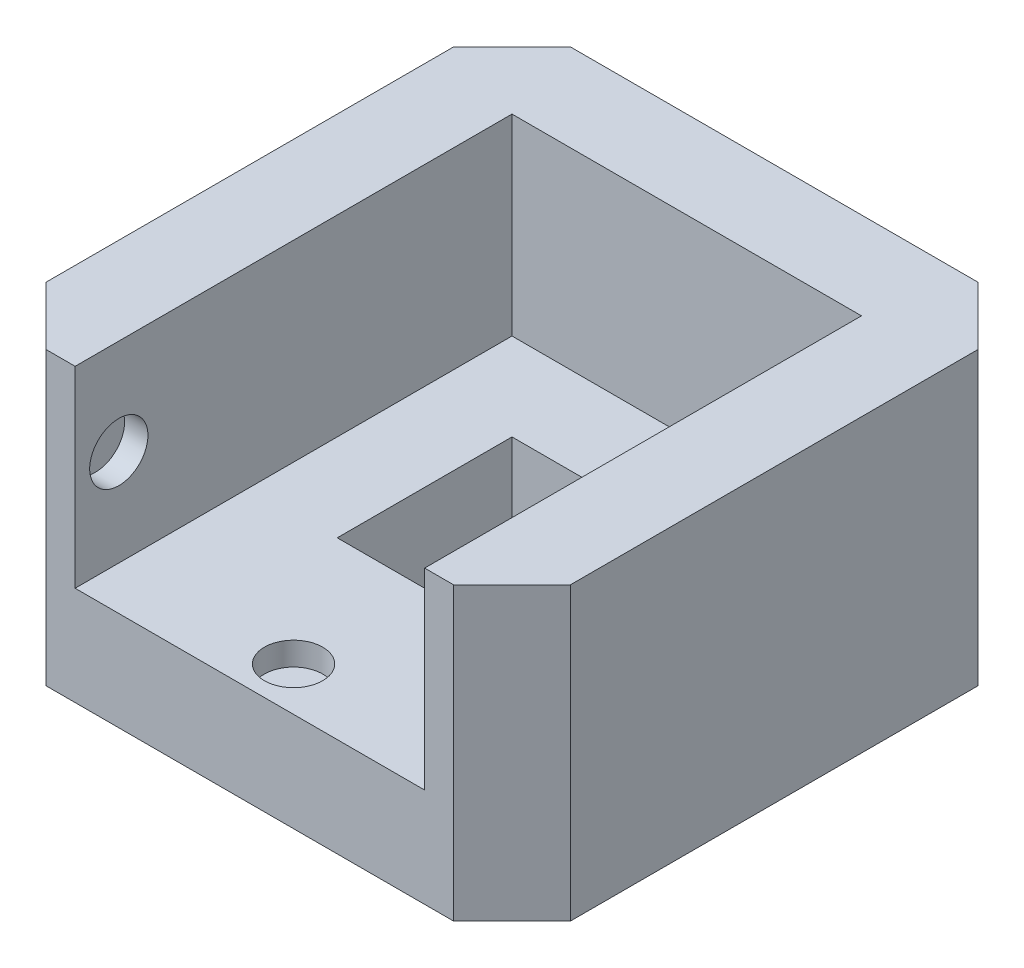
ISO-10303-21;
HEADER;
FILE_DESCRIPTION(('STEP AP214'),'2;1');
FILE_NAME('part.step','',(''),(''),'','','');
FILE_SCHEMA(('AUTOMOTIVE_DESIGN { 1 0 10303 214 1 1 1 1 }'));
ENDSEC;
DATA;
#1=APPLICATION_CONTEXT('core data for automotive mechanical design processes');
#2=APPLICATION_PROTOCOL_DEFINITION('international standard','automotive_design',2000,#1);
#3=PRODUCT_CONTEXT('',#1,'mechanical');
#4=PRODUCT('Part','Part','',(#3));
#5=PRODUCT_RELATED_PRODUCT_CATEGORY('part','',(#4));
#6=PRODUCT_DEFINITION_FORMATION('','',#4);
#7=PRODUCT_DEFINITION_CONTEXT('part definition',#1,'design');
#8=PRODUCT_DEFINITION('design','',#6,#7);
#9=PRODUCT_DEFINITION_SHAPE('','',#8);
#10=(LENGTH_UNIT() NAMED_UNIT(*) SI_UNIT(.MILLI.,.METRE.));
#11=(NAMED_UNIT(*) PLANE_ANGLE_UNIT() SI_UNIT($,.RADIAN.));
#12=(NAMED_UNIT(*) SI_UNIT($,.STERADIAN.) SOLID_ANGLE_UNIT());
#13=UNCERTAINTY_MEASURE_WITH_UNIT(LENGTH_MEASURE(1.E-05),#10,'distance_accuracy_value','');
#14=(GEOMETRIC_REPRESENTATION_CONTEXT(3) GLOBAL_UNCERTAINTY_ASSIGNED_CONTEXT((#13)) GLOBAL_UNIT_ASSIGNED_CONTEXT((#10,
#11,#12)) REPRESENTATION_CONTEXT('',''));
#15=CARTESIAN_POINT('',(0.,0.,0.));
#16=DIRECTION('',(0.,0.,1.));
#17=DIRECTION('',(1.,0.,0.));
#18=AXIS2_PLACEMENT_3D('',#15,#16,#17);
#19=CARTESIAN_POINT('',(0.,0.,0.));
#20=DIRECTION('',(0.,-1.,0.));
#21=DIRECTION('',(0.,0.,-1.));
#22=AXIS2_PLACEMENT_3D('',#19,#20,#21);
#23=PLANE('',#22);
#24=DIRECTION('',(1.,0.,0.));
#25=VECTOR('',#24,1.);
#26=CARTESIAN_POINT('',(-57.15,0.,57.15));
#27=LINE('',#26,#25);
#28=CARTESIAN_POINT('',(-44.45,0.,57.15));
#29=VERTEX_POINT('',#28);
#30=CARTESIAN_POINT('',(44.45,0.,57.15));
#31=VERTEX_POINT('',#30);
#32=EDGE_CURVE('E248',#29,#31,#27,.T.);
#33=ORIENTED_EDGE('',*,*,#32,.F.);
#34=DIRECTION('',(0.707106781186546,0.,0.707106781186549));
#35=VECTOR('',#34,1.);
#36=CARTESIAN_POINT('',(-50.8000000000001,0.,50.7999999999999));
#37=LINE('',#36,#35);
#38=CARTESIAN_POINT('',(-57.15,0.,44.45));
#39=VERTEX_POINT('',#38);
#40=EDGE_CURVE('E265',#29,#39,#37,.F.);
#41=ORIENTED_EDGE('',*,*,#40,.T.);
#42=DIRECTION('',(0.,0.,1.));
#43=VECTOR('',#42,1.);
#44=CARTESIAN_POINT('',(-57.15,0.,57.15));
#45=LINE('',#44,#43);
#46=CARTESIAN_POINT('',(-57.15,0.,-44.45));
#47=VERTEX_POINT('',#46);
#48=EDGE_CURVE('E245',#47,#39,#45,.T.);
#49=ORIENTED_EDGE('',*,*,#48,.F.);
#50=DIRECTION('',(-0.707106781186549,0.,0.707106781186546));
#51=VECTOR('',#50,1.);
#52=CARTESIAN_POINT('',(-50.7999999999999,0.,-50.8000000000001));
#53=LINE('',#52,#51);
#54=CARTESIAN_POINT('',(-44.45,0.,-57.15));
#55=VERTEX_POINT('',#54);
#56=EDGE_CURVE('E263',#47,#55,#53,.F.);
#57=ORIENTED_EDGE('',*,*,#56,.T.);
#58=DIRECTION('',(-1.,0.,0.));
#59=VECTOR('',#58,1.);
#60=CARTESIAN_POINT('',(-57.15,0.,-57.15));
#61=LINE('',#60,#59);
#62=CARTESIAN_POINT('',(44.45,0.,-57.15));
#63=VERTEX_POINT('',#62);
#64=EDGE_CURVE('E243',#63,#55,#61,.T.);
#65=ORIENTED_EDGE('',*,*,#64,.F.);
#66=DIRECTION('',(-0.707106781186546,0.,-0.707106781186549));
#67=VECTOR('',#66,1.);
#68=CARTESIAN_POINT('',(50.8000000000001,0.,-50.7999999999999));
#69=LINE('',#68,#67);
#70=CARTESIAN_POINT('',(57.15,0.,-44.45));
#71=VERTEX_POINT('',#70);
#72=EDGE_CURVE('E261',#63,#71,#69,.F.);
#73=ORIENTED_EDGE('',*,*,#72,.T.);
#74=DIRECTION('',(0.,0.,-1.));
#75=VECTOR('',#74,1.);
#76=CARTESIAN_POINT('',(57.15,0.,57.15));
#77=LINE('',#76,#75);
#78=CARTESIAN_POINT('',(57.15,0.,44.45));
#79=VERTEX_POINT('',#78);
#80=EDGE_CURVE('E240',#79,#71,#77,.T.);
#81=ORIENTED_EDGE('',*,*,#80,.F.);
#82=DIRECTION('',(0.707106781186549,0.,-0.707106781186546));
#83=VECTOR('',#82,1.);
#84=CARTESIAN_POINT('',(50.7999999999999,0.,50.8000000000001));
#85=LINE('',#84,#83);
#86=EDGE_CURVE('E259',#79,#31,#85,.F.);
#87=ORIENTED_EDGE('',*,*,#86,.T.);
#88=EDGE_LOOP('',(#33,#41,#49,#57,#65,#73,#81,#87));
#89=FACE_BOUND('',#88,.T.);
#90=DIRECTION('',(1.,0.,0.));
#91=VECTOR('',#90,1.);
#92=CARTESIAN_POINT('',(-19.05,0.,19.05));
#93=LINE('',#92,#91);
#94=CARTESIAN_POINT('',(-19.05,0.,19.05));
#95=VERTEX_POINT('',#94);
#96=CARTESIAN_POINT('',(19.05,0.,19.05));
#97=VERTEX_POINT('',#96);
#98=EDGE_CURVE('E229',#95,#97,#93,.T.);
#99=ORIENTED_EDGE('',*,*,#98,.T.);
#100=DIRECTION('',(0.,0.,-1.));
#101=VECTOR('',#100,1.);
#102=CARTESIAN_POINT('',(19.05,0.,19.05));
#103=LINE('',#102,#101);
#104=CARTESIAN_POINT('',(19.05,0.,-19.05));
#105=VERTEX_POINT('',#104);
#106=EDGE_CURVE('E220',#97,#105,#103,.T.);
#107=ORIENTED_EDGE('',*,*,#106,.T.);
#108=DIRECTION('',(-1.,0.,0.));
#109=VECTOR('',#108,1.);
#110=CARTESIAN_POINT('',(-19.05,0.,-19.05));
#111=LINE('',#110,#109);
#112=CARTESIAN_POINT('',(-19.05,0.,-19.05));
#113=VERTEX_POINT('',#112);
#114=EDGE_CURVE('E223',#105,#113,#111,.T.);
#115=ORIENTED_EDGE('',*,*,#114,.T.);
#116=DIRECTION('',(0.,0.,1.));
#117=VECTOR('',#116,1.);
#118=CARTESIAN_POINT('',(-19.05,0.,19.05));
#119=LINE('',#118,#117);
#120=EDGE_CURVE('E226',#113,#95,#119,.T.);
#121=ORIENTED_EDGE('',*,*,#120,.T.);
#122=EDGE_LOOP('',(#99,#107,#115,#121));
#123=FACE_BOUND('',#122,.T.);
#124=ADVANCED_FACE('F46',(#89,#123),#23,.T.);
#125=CARTESIAN_POINT('',(57.15,76.2,57.15));
#126=DIRECTION('',(-1.,0.,0.));
#127=DIRECTION('',(0.,0.,1.));
#128=AXIS2_PLACEMENT_3D('',#125,#126,#127);
#129=PLANE('',#128);
#130=ORIENTED_EDGE('',*,*,#80,.T.);
#131=DIRECTION('',(0.,1.,0.));
#132=VECTOR('',#131,1.);
#133=CARTESIAN_POINT('',(57.15,76.2,-44.45));
#134=LINE('',#133,#132);
#135=CARTESIAN_POINT('',(57.15,63.5,-44.4499999999999));
#136=VERTEX_POINT('',#135);
#137=EDGE_CURVE('E11',#71,#136,#134,.T.);
#138=ORIENTED_EDGE('',*,*,#137,.T.);
#139=DIRECTION('',(0.,0.,-1.));
#140=VECTOR('',#139,1.);
#141=CARTESIAN_POINT('',(57.15,63.5,57.15));
#142=LINE('',#141,#140);
#143=CARTESIAN_POINT('',(57.15,63.5,44.45));
#144=VERTEX_POINT('',#143);
#145=EDGE_CURVE('E196',#144,#136,#142,.T.);
#146=ORIENTED_EDGE('',*,*,#145,.F.);
#147=DIRECTION('',(0.,-1.,0.));
#148=VECTOR('',#147,1.);
#149=CARTESIAN_POINT('',(57.15,76.2,44.45));
#150=LINE('',#149,#148);
#151=EDGE_CURVE('E55',#144,#79,#150,.T.);
#152=ORIENTED_EDGE('',*,*,#151,.T.);
#153=EDGE_LOOP('',(#130,#138,#146,#152));
#154=FACE_BOUND('',#153,.T.);
#155=ADVANCED_FACE('F288',(#154),#129,.F.);
#156=CARTESIAN_POINT('',(-57.15,76.2,-57.15));
#157=DIRECTION('',(0.,0.,1.));
#158=DIRECTION('',(1.,0.,0.));
#159=AXIS2_PLACEMENT_3D('',#156,#157,#158);
#160=PLANE('',#159);
#161=ORIENTED_EDGE('',*,*,#64,.T.);
#162=DIRECTION('',(0.,1.,0.));
#163=VECTOR('',#162,1.);
#164=CARTESIAN_POINT('',(-44.45,76.2,-57.15));
#165=LINE('',#164,#163);
#166=CARTESIAN_POINT('',(-44.45,63.5,-57.15));
#167=VERTEX_POINT('',#166);
#168=EDGE_CURVE('E70',#55,#167,#165,.T.);
#169=ORIENTED_EDGE('',*,*,#168,.T.);
#170=DIRECTION('',(-1.,0.,0.));
#171=VECTOR('',#170,1.);
#172=CARTESIAN_POINT('',(-57.15,63.5,-57.15));
#173=LINE('',#172,#171);
#174=CARTESIAN_POINT('',(44.45,63.5,-57.15));
#175=VERTEX_POINT('',#174);
#176=EDGE_CURVE('E199',#175,#167,#173,.T.);
#177=ORIENTED_EDGE('',*,*,#176,.F.);
#178=DIRECTION('',(0.,-1.,0.));
#179=VECTOR('',#178,1.);
#180=CARTESIAN_POINT('',(44.45,76.2,-57.15));
#181=LINE('',#180,#179);
#182=EDGE_CURVE('E280',#175,#63,#181,.T.);
#183=ORIENTED_EDGE('',*,*,#182,.T.);
#184=EDGE_LOOP('',(#161,#169,#177,#183));
#185=FACE_BOUND('',#184,.T.);
#186=ADVANCED_FACE('F300',(#185),#160,.F.);
#187=CARTESIAN_POINT('',(-57.15,76.2,57.15));
#188=DIRECTION('',(1.,0.,0.));
#189=DIRECTION('',(0.,0.,-1.));
#190=AXIS2_PLACEMENT_3D('',#187,#188,#189);
#191=PLANE('',#190);
#192=ORIENTED_EDGE('',*,*,#48,.T.);
#193=DIRECTION('',(0.,1.,0.));
#194=VECTOR('',#193,1.);
#195=CARTESIAN_POINT('',(-57.15,76.2,44.45));
#196=LINE('',#195,#194);
#197=CARTESIAN_POINT('',(-57.15,63.5,44.45));
#198=VERTEX_POINT('',#197);
#199=EDGE_CURVE('E270',#39,#198,#196,.T.);
#200=ORIENTED_EDGE('',*,*,#199,.T.);
#201=DIRECTION('',(0.,0.,1.));
#202=VECTOR('',#201,1.);
#203=CARTESIAN_POINT('',(-57.15,63.5,57.15));
#204=LINE('',#203,#202);
#205=CARTESIAN_POINT('',(-57.15,63.5,-44.45));
#206=VERTEX_POINT('',#205);
#207=EDGE_CURVE('E201',#206,#198,#204,.T.);
#208=ORIENTED_EDGE('',*,*,#207,.F.);
#209=DIRECTION('',(0.,-1.,0.));
#210=VECTOR('',#209,1.);
#211=CARTESIAN_POINT('',(-57.15,76.2,-44.45));
#212=LINE('',#211,#210);
#213=EDGE_CURVE('E267',#206,#47,#212,.T.);
#214=ORIENTED_EDGE('',*,*,#213,.T.);
#215=EDGE_LOOP('',(#192,#200,#208,#214));
#216=FACE_BOUND('',#215,.T.);
#217=ADVANCED_FACE('F309',(#216),#191,.F.);
#218=CARTESIAN_POINT('',(-57.15,76.2,57.15));
#219=DIRECTION('',(0.,0.,-1.));
#220=DIRECTION('',(-1.,0.,0.));
#221=AXIS2_PLACEMENT_3D('',#218,#219,#220);
#222=PLANE('',#221);
#223=DIRECTION('',(1.,0.,0.));
#224=VECTOR('',#223,1.);
#225=CARTESIAN_POINT('',(-38.1,21.59,57.15));
#226=LINE('',#225,#224);
#227=CARTESIAN_POINT('',(-38.1,21.59,57.15));
#228=VERTEX_POINT('',#227);
#229=CARTESIAN_POINT('',(38.1,21.59,57.15));
#230=VERTEX_POINT('',#229);
#231=EDGE_CURVE('E167',#228,#230,#226,.T.);
#232=ORIENTED_EDGE('',*,*,#231,.F.);
#233=DIRECTION('',(0.,-1.,0.));
#234=VECTOR('',#233,1.);
#235=CARTESIAN_POINT('',(-38.1,63.5,57.15));
#236=LINE('',#235,#234);
#237=CARTESIAN_POINT('',(-38.1,63.5,57.15));
#238=VERTEX_POINT('',#237);
#239=EDGE_CURVE('E176',#238,#228,#236,.T.);
#240=ORIENTED_EDGE('',*,*,#239,.F.);
#241=DIRECTION('',(1.,0.,0.));
#242=VECTOR('',#241,1.);
#243=CARTESIAN_POINT('',(-57.15,63.5,57.15));
#244=LINE('',#243,#242);
#245=CARTESIAN_POINT('',(-44.45,63.5,57.15));
#246=VERTEX_POINT('',#245);
#247=EDGE_CURVE('E205',#246,#238,#244,.T.);
#248=ORIENTED_EDGE('',*,*,#247,.F.);
#249=DIRECTION('',(0.,-1.,0.));
#250=VECTOR('',#249,1.);
#251=CARTESIAN_POINT('',(-44.45,76.2,57.15));
#252=LINE('',#251,#250);
#253=EDGE_CURVE('E256',#246,#29,#252,.T.);
#254=ORIENTED_EDGE('',*,*,#253,.T.);
#255=ORIENTED_EDGE('',*,*,#32,.T.);
#256=DIRECTION('',(0.,1.,0.));
#257=VECTOR('',#256,1.);
#258=CARTESIAN_POINT('',(44.45,76.2,57.15));
#259=LINE('',#258,#257);
#260=CARTESIAN_POINT('',(44.45,63.5,57.15));
#261=VERTEX_POINT('',#260);
#262=EDGE_CURVE('E253',#31,#261,#259,.T.);
#263=ORIENTED_EDGE('',*,*,#262,.T.);
#264=CARTESIAN_POINT('',(38.1,63.5,57.15));
#265=VERTEX_POINT('',#264);
#266=EDGE_CURVE('E204',#265,#261,#244,.T.);
#267=ORIENTED_EDGE('',*,*,#266,.F.);
#268=DIRECTION('',(0.,1.,0.));
#269=VECTOR('',#268,1.);
#270=CARTESIAN_POINT('',(38.1,63.5,57.15));
#271=LINE('',#270,#269);
#272=EDGE_CURVE('E186',#230,#265,#271,.T.);
#273=ORIENTED_EDGE('',*,*,#272,.F.);
#274=EDGE_LOOP('',(#232,#240,#248,#254,#255,#263,#267,#273));
#275=FACE_BOUND('',#274,.T.);
#276=ADVANCED_FACE('F184',(#275),#222,.F.);
#277=CARTESIAN_POINT('',(19.05,76.2,19.05));
#278=DIRECTION('',(-1.,0.,0.));
#279=DIRECTION('',(0.,0.,1.));
#280=AXIS2_PLACEMENT_3D('',#277,#278,#279);
#281=PLANE('',#280);
#282=DIRECTION('',(0.,0.,1.));
#283=VECTOR('',#282,1.);
#284=CARTESIAN_POINT('',(19.05,21.59,19.05));
#285=LINE('',#284,#283);
#286=CARTESIAN_POINT('',(19.05,21.59,-19.05));
#287=VERTEX_POINT('',#286);
#288=CARTESIAN_POINT('',(19.05,21.59,19.05));
#289=VERTEX_POINT('',#288);
#290=EDGE_CURVE('E218',#287,#289,#285,.T.);
#291=ORIENTED_EDGE('',*,*,#290,.F.);
#292=DIRECTION('',(0.,-1.,0.));
#293=VECTOR('',#292,1.);
#294=CARTESIAN_POINT('',(19.05,76.2,-19.05));
#295=LINE('',#294,#293);
#296=EDGE_CURVE('E238',#287,#105,#295,.T.);
#297=ORIENTED_EDGE('',*,*,#296,.T.);
#298=ORIENTED_EDGE('',*,*,#106,.F.);
#299=DIRECTION('',(0.,-1.,0.));
#300=VECTOR('',#299,1.);
#301=CARTESIAN_POINT('',(19.05,76.2,19.05));
#302=LINE('',#301,#300);
#303=EDGE_CURVE('E232',#289,#97,#302,.T.);
#304=ORIENTED_EDGE('',*,*,#303,.F.);
#305=EDGE_LOOP('',(#291,#297,#298,#304));
#306=FACE_BOUND('',#305,.T.);
#307=ADVANCED_FACE('F339',(#306),#281,.T.);
#308=CARTESIAN_POINT('',(-19.05,76.2,-19.05));
#309=DIRECTION('',(0.,0.,1.));
#310=DIRECTION('',(1.,0.,0.));
#311=AXIS2_PLACEMENT_3D('',#308,#309,#310);
#312=PLANE('',#311);
#313=DIRECTION('',(1.,0.,0.));
#314=VECTOR('',#313,1.);
#315=CARTESIAN_POINT('',(-19.05,21.59,-19.05));
#316=LINE('',#315,#314);
#317=CARTESIAN_POINT('',(-19.05,21.59,-19.05));
#318=VERTEX_POINT('',#317);
#319=EDGE_CURVE('E216',#318,#287,#316,.T.);
#320=ORIENTED_EDGE('',*,*,#319,.F.);
#321=DIRECTION('',(0.,-1.,0.));
#322=VECTOR('',#321,1.);
#323=CARTESIAN_POINT('',(-19.05,76.2,-19.05));
#324=LINE('',#323,#322);
#325=EDGE_CURVE('E236',#318,#113,#324,.T.);
#326=ORIENTED_EDGE('',*,*,#325,.T.);
#327=ORIENTED_EDGE('',*,*,#114,.F.);
#328=ORIENTED_EDGE('',*,*,#296,.F.);
#329=EDGE_LOOP('',(#320,#326,#327,#328));
#330=FACE_BOUND('',#329,.T.);
#331=ADVANCED_FACE('F479',(#330),#312,.T.);
#332=CARTESIAN_POINT('',(-19.05,76.2,19.05));
#333=DIRECTION('',(1.,0.,0.));
#334=DIRECTION('',(0.,0.,-1.));
#335=AXIS2_PLACEMENT_3D('',#332,#333,#334);
#336=PLANE('',#335);
#337=DIRECTION('',(0.,0.,-1.));
#338=VECTOR('',#337,1.);
#339=CARTESIAN_POINT('',(-19.05,21.59,19.05));
#340=LINE('',#339,#338);
#341=CARTESIAN_POINT('',(-19.05,21.59,19.05));
#342=VERTEX_POINT('',#341);
#343=EDGE_CURVE('E212',#342,#318,#340,.T.);
#344=ORIENTED_EDGE('',*,*,#343,.F.);
#345=DIRECTION('',(0.,-1.,0.));
#346=VECTOR('',#345,1.);
#347=CARTESIAN_POINT('',(-19.05,76.2,19.05));
#348=LINE('',#347,#346);
#349=EDGE_CURVE('E234',#342,#95,#348,.T.);
#350=ORIENTED_EDGE('',*,*,#349,.T.);
#351=ORIENTED_EDGE('',*,*,#120,.F.);
#352=ORIENTED_EDGE('',*,*,#325,.F.);
#353=EDGE_LOOP('',(#344,#350,#351,#352));
#354=FACE_BOUND('',#353,.T.);
#355=ADVANCED_FACE('F476',(#354),#336,.T.);
#356=CARTESIAN_POINT('',(-19.05,76.2,19.05));
#357=DIRECTION('',(0.,0.,-1.));
#358=DIRECTION('',(-1.,0.,0.));
#359=AXIS2_PLACEMENT_3D('',#356,#357,#358);
#360=PLANE('',#359);
#361=DIRECTION('',(-1.,0.,0.));
#362=VECTOR('',#361,1.);
#363=CARTESIAN_POINT('',(-19.05,21.59,19.05));
#364=LINE('',#363,#362);
#365=EDGE_CURVE('E251',#289,#342,#364,.T.);
#366=ORIENTED_EDGE('',*,*,#365,.F.);
#367=ORIENTED_EDGE('',*,*,#303,.T.);
#368=ORIENTED_EDGE('',*,*,#98,.F.);
#369=ORIENTED_EDGE('',*,*,#349,.F.);
#370=EDGE_LOOP('',(#366,#367,#368,#369));
#371=FACE_BOUND('',#370,.T.);
#372=ADVANCED_FACE('F384',(#371),#360,.T.);
#373=CARTESIAN_POINT('',(38.1,21.59,38.1));
#374=DIRECTION('',(1.,0.,0.));
#375=DIRECTION('',(0.,0.,-1.));
#376=AXIS2_PLACEMENT_3D('',#373,#374,#375);
#377=PLANE('',#376);
#378=CARTESIAN_POINT('',(38.1,42.545,47.625));
#379=DIRECTION('',(-1.,0.,0.));
#380=DIRECTION('',(0.,0.,1.));
#381=AXIS2_PLACEMENT_3D('',#378,#379,#380);
#382=CIRCLE('',#381,6.35);
#383=CARTESIAN_POINT('',(38.1,42.545,53.975));
#384=VERTEX_POINT('',#383);
#385=EDGE_CURVE('E569',#384,#384,#382,.T.);
#386=ORIENTED_EDGE('',*,*,#385,.F.);
#387=EDGE_LOOP('',(#386));
#388=FACE_BOUND('',#387,.T.);
#389=DIRECTION('',(0.,0.,-1.));
#390=VECTOR('',#389,1.);
#391=CARTESIAN_POINT('',(38.1,21.59,38.1));
#392=LINE('',#391,#390);
#393=CARTESIAN_POINT('',(38.1,21.59,-38.1));
#394=VERTEX_POINT('',#393);
#395=EDGE_CURVE('E207',#230,#394,#392,.T.);
#396=ORIENTED_EDGE('',*,*,#395,.F.);
#397=ORIENTED_EDGE('',*,*,#272,.T.);
#398=DIRECTION('',(0.,0.,-1.));
#399=VECTOR('',#398,1.);
#400=CARTESIAN_POINT('',(38.1,63.5,38.1));
#401=LINE('',#400,#399);
#402=CARTESIAN_POINT('',(38.1,63.5,-38.1));
#403=VERTEX_POINT('',#402);
#404=EDGE_CURVE('E62',#265,#403,#401,.T.);
#405=ORIENTED_EDGE('',*,*,#404,.T.);
#406=DIRECTION('',(0.,1.,0.));
#407=VECTOR('',#406,1.);
#408=CARTESIAN_POINT('',(38.1,21.59,-38.1));
#409=LINE('',#408,#407);
#410=EDGE_CURVE('E173',#394,#403,#409,.T.);
#411=ORIENTED_EDGE('',*,*,#410,.F.);
#412=EDGE_LOOP('',(#396,#397,#405,#411));
#413=FACE_BOUND('',#412,.T.);
#414=ADVANCED_FACE('F319',(#388,#413),#377,.F.);
#415=CARTESIAN_POINT('',(-38.1,21.59,38.1));
#416=DIRECTION('',(-1.,0.,0.));
#417=DIRECTION('',(0.,0.,1.));
#418=AXIS2_PLACEMENT_3D('',#415,#416,#417);
#419=PLANE('',#418);
#420=CARTESIAN_POINT('',(-38.1,42.545,47.625));
#421=DIRECTION('',(1.,0.,0.));
#422=DIRECTION('',(0.,0.,-1.));
#423=AXIS2_PLACEMENT_3D('',#420,#421,#422);
#424=CIRCLE('',#423,6.35);
#425=CARTESIAN_POINT('',(-38.1,42.545,41.275));
#426=VERTEX_POINT('',#425);
#427=EDGE_CURVE('E570',#426,#426,#424,.T.);
#428=ORIENTED_EDGE('',*,*,#427,.F.);
#429=EDGE_LOOP('',(#428));
#430=FACE_BOUND('',#429,.T.);
#431=DIRECTION('',(0.,1.,0.));
#432=VECTOR('',#431,1.);
#433=CARTESIAN_POINT('',(-38.1,21.59,-38.1));
#434=LINE('',#433,#432);
#435=CARTESIAN_POINT('',(-38.1,21.59,-38.1));
#436=VERTEX_POINT('',#435);
#437=CARTESIAN_POINT('',(-38.1,63.5,-38.1));
#438=VERTEX_POINT('',#437);
#439=EDGE_CURVE('E210',#436,#438,#434,.T.);
#440=ORIENTED_EDGE('',*,*,#439,.T.);
#441=DIRECTION('',(0.,0.,1.));
#442=VECTOR('',#441,1.);
#443=CARTESIAN_POINT('',(-38.1,63.5,38.1));
#444=LINE('',#443,#442);
#445=EDGE_CURVE('E178',#438,#238,#444,.T.);
#446=ORIENTED_EDGE('',*,*,#445,.T.);
#447=ORIENTED_EDGE('',*,*,#239,.T.);
#448=DIRECTION('',(0.,0.,1.));
#449=VECTOR('',#448,1.);
#450=CARTESIAN_POINT('',(-38.1,21.59,38.1));
#451=LINE('',#450,#449);
#452=EDGE_CURVE('E162',#436,#228,#451,.T.);
#453=ORIENTED_EDGE('',*,*,#452,.F.);
#454=EDGE_LOOP('',(#440,#446,#447,#453));
#455=FACE_BOUND('',#454,.T.);
#456=ADVANCED_FACE('F177',(#430,#455),#419,.F.);
#457=CARTESIAN_POINT('',(-38.1,21.59,-38.1));
#458=DIRECTION('',(0.,0.,-1.));
#459=DIRECTION('',(-1.,0.,0.));
#460=AXIS2_PLACEMENT_3D('',#457,#458,#459);
#461=PLANE('',#460);
#462=ORIENTED_EDGE('',*,*,#410,.T.);
#463=DIRECTION('',(-1.,0.,0.));
#464=VECTOR('',#463,1.);
#465=CARTESIAN_POINT('',(-38.1,63.5,-38.1));
#466=LINE('',#465,#464);
#467=EDGE_CURVE('E192',#403,#438,#466,.T.);
#468=ORIENTED_EDGE('',*,*,#467,.T.);
#469=ORIENTED_EDGE('',*,*,#439,.F.);
#470=DIRECTION('',(-1.,0.,0.));
#471=VECTOR('',#470,1.);
#472=CARTESIAN_POINT('',(-38.1,21.59,-38.1));
#473=LINE('',#472,#471);
#474=EDGE_CURVE('E170',#394,#436,#473,.T.);
#475=ORIENTED_EDGE('',*,*,#474,.F.);
#476=EDGE_LOOP('',(#462,#468,#469,#475));
#477=FACE_BOUND('',#476,.T.);
#478=ADVANCED_FACE('F317',(#477),#461,.F.);
#479=CARTESIAN_POINT('',(0.,21.59,0.));
#480=DIRECTION('',(0.,-1.,0.));
#481=DIRECTION('',(0.,0.,-1.));
#482=AXIS2_PLACEMENT_3D('',#479,#480,#481);
#483=PLANE('',#482);
#484=CARTESIAN_POINT('',(0.,21.59,47.625));
#485=DIRECTION('',(0.,1.,0.));
#486=DIRECTION('',(0.,0.,1.));
#487=AXIS2_PLACEMENT_3D('',#484,#485,#486);
#488=CIRCLE('',#487,6.35);
#489=CARTESIAN_POINT('',(0.,21.59,53.975));
#490=VERTEX_POINT('',#489);
#491=EDGE_CURVE('E579',#490,#490,#488,.T.);
#492=ORIENTED_EDGE('',*,*,#491,.F.);
#493=EDGE_LOOP('',(#492));
#494=FACE_BOUND('',#493,.T.);
#495=ORIENTED_EDGE('',*,*,#290,.T.);
#496=ORIENTED_EDGE('',*,*,#365,.T.);
#497=ORIENTED_EDGE('',*,*,#343,.T.);
#498=ORIENTED_EDGE('',*,*,#319,.T.);
#499=EDGE_LOOP('',(#495,#496,#497,#498));
#500=FACE_BOUND('',#499,.T.);
#501=ORIENTED_EDGE('',*,*,#395,.T.);
#502=ORIENTED_EDGE('',*,*,#474,.T.);
#503=ORIENTED_EDGE('',*,*,#452,.T.);
#504=ORIENTED_EDGE('',*,*,#231,.T.);
#505=EDGE_LOOP('',(#501,#502,#503,#504));
#506=FACE_BOUND('',#505,.T.);
#507=ADVANCED_FACE('F165',(#494,#500,#506),#483,.F.);
#508=CARTESIAN_POINT('',(0.,63.5,0.));
#509=DIRECTION('',(0.,-1.,0.));
#510=DIRECTION('',(0.,0.,-1.));
#511=AXIS2_PLACEMENT_3D('',#508,#509,#510);
#512=PLANE('',#511);
#513=ORIENTED_EDGE('',*,*,#247,.T.);
#514=ORIENTED_EDGE('',*,*,#445,.F.);
#515=ORIENTED_EDGE('',*,*,#467,.F.);
#516=ORIENTED_EDGE('',*,*,#404,.F.);
#517=ORIENTED_EDGE('',*,*,#266,.T.);
#518=DIRECTION('',(-0.707106781186549,0.,0.707106781186546));
#519=VECTOR('',#518,1.);
#520=CARTESIAN_POINT('',(57.15,63.5,44.45));
#521=LINE('',#520,#519);
#522=EDGE_CURVE('E272',#261,#144,#521,.F.);
#523=ORIENTED_EDGE('',*,*,#522,.T.);
#524=ORIENTED_EDGE('',*,*,#145,.T.);
#525=DIRECTION('',(0.707106781186546,0.,0.707106781186549));
#526=VECTOR('',#525,1.);
#527=CARTESIAN_POINT('',(44.45,63.5,-57.15));
#528=LINE('',#527,#526);
#529=EDGE_CURVE('E274',#136,#175,#528,.F.);
#530=ORIENTED_EDGE('',*,*,#529,.T.);
#531=ORIENTED_EDGE('',*,*,#176,.T.);
#532=DIRECTION('',(0.707106781186549,0.,-0.707106781186546));
#533=VECTOR('',#532,1.);
#534=CARTESIAN_POINT('',(-57.15,63.5,-44.45));
#535=LINE('',#534,#533);
#536=EDGE_CURVE('E276',#167,#206,#535,.F.);
#537=ORIENTED_EDGE('',*,*,#536,.T.);
#538=ORIENTED_EDGE('',*,*,#207,.T.);
#539=DIRECTION('',(-0.707106781186546,0.,-0.707106781186549));
#540=VECTOR('',#539,1.);
#541=CARTESIAN_POINT('',(-44.45,63.5,57.15));
#542=LINE('',#541,#540);
#543=EDGE_CURVE('E278',#198,#246,#542,.F.);
#544=ORIENTED_EDGE('',*,*,#543,.T.);
#545=EDGE_LOOP('',(#513,#514,#515,#516,#517,#523,#524,#530,#531,#537,#538,#544));
#546=FACE_BOUND('',#545,.T.);
#547=ADVANCED_FACE('F302',(#546),#512,.F.);
#548=CARTESIAN_POINT('',(-44.45,76.2,57.15));
#549=DIRECTION('',(0.707106781186549,0.,-0.707106781186546));
#550=DIRECTION('',(0.,-1.,0.));
#551=AXIS2_PLACEMENT_3D('',#548,#549,#550);
#552=PLANE('',#551);
#553=ORIENTED_EDGE('',*,*,#543,.F.);
#554=ORIENTED_EDGE('',*,*,#199,.F.);
#555=ORIENTED_EDGE('',*,*,#40,.F.);
#556=ORIENTED_EDGE('',*,*,#253,.F.);
#557=EDGE_LOOP('',(#553,#554,#555,#556));
#558=FACE_BOUND('',#557,.T.);
#559=ADVANCED_FACE('F314',(#558),#552,.F.);
#560=CARTESIAN_POINT('',(-57.15,76.2,-44.45));
#561=DIRECTION('',(0.707106781186546,0.,0.707106781186549));
#562=DIRECTION('',(0.,-1.,0.));
#563=AXIS2_PLACEMENT_3D('',#560,#561,#562);
#564=PLANE('',#563);
#565=ORIENTED_EDGE('',*,*,#536,.F.);
#566=ORIENTED_EDGE('',*,*,#168,.F.);
#567=ORIENTED_EDGE('',*,*,#56,.F.);
#568=ORIENTED_EDGE('',*,*,#213,.F.);
#569=EDGE_LOOP('',(#565,#566,#567,#568));
#570=FACE_BOUND('',#569,.T.);
#571=ADVANCED_FACE('F306',(#570),#564,.F.);
#572=CARTESIAN_POINT('',(44.45,76.2,-57.15));
#573=DIRECTION('',(-0.707106781186549,0.,0.707106781186546));
#574=DIRECTION('',(0.,-1.,0.));
#575=AXIS2_PLACEMENT_3D('',#572,#573,#574);
#576=PLANE('',#575);
#577=ORIENTED_EDGE('',*,*,#529,.F.);
#578=ORIENTED_EDGE('',*,*,#137,.F.);
#579=ORIENTED_EDGE('',*,*,#72,.F.);
#580=ORIENTED_EDGE('',*,*,#182,.F.);
#581=EDGE_LOOP('',(#577,#578,#579,#580));
#582=FACE_BOUND('',#581,.T.);
#583=ADVANCED_FACE('F299',(#582),#576,.F.);
#584=CARTESIAN_POINT('',(57.15,76.2,44.45));
#585=DIRECTION('',(-0.707106781186546,0.,-0.707106781186549));
#586=DIRECTION('',(0.,-1.,0.));
#587=AXIS2_PLACEMENT_3D('',#584,#585,#586);
#588=PLANE('',#587);
#589=ORIENTED_EDGE('',*,*,#522,.F.);
#590=ORIENTED_EDGE('',*,*,#262,.F.);
#591=ORIENTED_EDGE('',*,*,#86,.F.);
#592=ORIENTED_EDGE('',*,*,#151,.F.);
#593=EDGE_LOOP('',(#589,#590,#591,#592));
#594=FACE_BOUND('',#593,.T.);
#595=ADVANCED_FACE('F49',(#594),#588,.F.);
#596=CARTESIAN_POINT('',(0.,16.51,47.625));
#597=DIRECTION('',(0.,1.,0.));
#598=DIRECTION('',(0.,0.,1.));
#599=AXIS2_PLACEMENT_3D('',#596,#597,#598);
#600=CYLINDRICAL_SURFACE('',#599,6.35);
#601=CARTESIAN_POINT('',(0.,16.51,47.625));
#602=DIRECTION('',(0.,1.,0.));
#603=DIRECTION('',(0.,0.,1.));
#604=AXIS2_PLACEMENT_3D('',#601,#602,#603);
#605=CIRCLE('',#604,6.35);
#606=CARTESIAN_POINT('',(0.,16.51,53.975));
#607=VERTEX_POINT('',#606);
#608=EDGE_CURVE('E182',#607,#607,#605,.T.);
#609=ORIENTED_EDGE('',*,*,#608,.F.);
#610=EDGE_LOOP('',(#609));
#611=FACE_BOUND('',#610,.T.);
#612=ORIENTED_EDGE('',*,*,#491,.T.);
#613=EDGE_LOOP('',(#612));
#614=FACE_BOUND('',#613,.T.);
#615=ADVANCED_FACE('F321',(#611,#614),#600,.F.);
#616=CARTESIAN_POINT('',(0.,16.51,47.625));
#617=DIRECTION('',(0.,1.,0.));
#618=DIRECTION('',(0.,0.,1.));
#619=AXIS2_PLACEMENT_3D('',#616,#617,#618);
#620=PLANE('',#619);
#621=ORIENTED_EDGE('',*,*,#608,.T.);
#622=EDGE_LOOP('',(#621));
#623=FACE_BOUND('',#622,.T.);
#624=ADVANCED_FACE('F327',(#623),#620,.T.);
#625=CARTESIAN_POINT('',(43.18,42.545,47.625));
#626=DIRECTION('',(-1.,0.,0.));
#627=DIRECTION('',(0.,0.,1.));
#628=AXIS2_PLACEMENT_3D('',#625,#626,#627);
#629=CYLINDRICAL_SURFACE('',#628,6.35);
#630=CARTESIAN_POINT('',(43.18,42.545,47.625));
#631=DIRECTION('',(-1.,0.,0.));
#632=DIRECTION('',(0.,0.,1.));
#633=AXIS2_PLACEMENT_3D('',#630,#631,#632);
#634=CIRCLE('',#633,6.35);
#635=CARTESIAN_POINT('',(43.18,42.545,53.975));
#636=VERTEX_POINT('',#635);
#637=EDGE_CURVE('E573',#636,#636,#634,.T.);
#638=ORIENTED_EDGE('',*,*,#637,.F.);
#639=EDGE_LOOP('',(#638));
#640=FACE_BOUND('',#639,.T.);
#641=ORIENTED_EDGE('',*,*,#385,.T.);
#642=EDGE_LOOP('',(#641));
#643=FACE_BOUND('',#642,.T.);
#644=ADVANCED_FACE('F430',(#640,#643),#629,.F.);
#645=CARTESIAN_POINT('',(43.18,42.545,47.625));
#646=DIRECTION('',(-1.,0.,0.));
#647=DIRECTION('',(0.,0.,1.));
#648=AXIS2_PLACEMENT_3D('',#645,#646,#647);
#649=PLANE('',#648);
#650=ORIENTED_EDGE('',*,*,#637,.T.);
#651=EDGE_LOOP('',(#650));
#652=FACE_BOUND('',#651,.T.);
#653=ADVANCED_FACE('F439',(#652),#649,.T.);
#654=CARTESIAN_POINT('',(-43.18,42.545,47.625));
#655=DIRECTION('',(1.,0.,0.));
#656=DIRECTION('',(0.,0.,-1.));
#657=AXIS2_PLACEMENT_3D('',#654,#655,#656);
#658=CYLINDRICAL_SURFACE('',#657,6.35);
#659=CARTESIAN_POINT('',(-43.18,42.545,47.625));
#660=DIRECTION('',(1.,0.,0.));
#661=DIRECTION('',(0.,0.,-1.));
#662=AXIS2_PLACEMENT_3D('',#659,#660,#661);
#663=CIRCLE('',#662,6.35);
#664=CARTESIAN_POINT('',(-43.18,42.545,41.275));
#665=VERTEX_POINT('',#664);
#666=EDGE_CURVE('E568',#665,#665,#663,.T.);
#667=ORIENTED_EDGE('',*,*,#666,.F.);
#668=EDGE_LOOP('',(#667));
#669=FACE_BOUND('',#668,.T.);
#670=ORIENTED_EDGE('',*,*,#427,.T.);
#671=EDGE_LOOP('',(#670));
#672=FACE_BOUND('',#671,.T.);
#673=ADVANCED_FACE('F448',(#669,#672),#658,.F.);
#674=CARTESIAN_POINT('',(-43.18,42.545,47.625));
#675=DIRECTION('',(1.,0.,0.));
#676=DIRECTION('',(0.,0.,-1.));
#677=AXIS2_PLACEMENT_3D('',#674,#675,#676);
#678=PLANE('',#677);
#679=ORIENTED_EDGE('',*,*,#666,.T.);
#680=EDGE_LOOP('',(#679));
#681=FACE_BOUND('',#680,.T.);
#682=ADVANCED_FACE('F457',(#681),#678,.T.);
#683=CLOSED_SHELL('',(#124,#155,#186,#217,#276,#307,#331,#355,#372,#414,#456,#478,#507,#547,
#559,#571,#583,#595,#615,#624,#644,#653,#673,#682));
#684=MANIFOLD_SOLID_BREP('B2',#683);
#685=ADVANCED_BREP_SHAPE_REPRESENTATION('',(#18,#684),#14);
#686=SHAPE_DEFINITION_REPRESENTATION(#9,#685);
ENDSEC;
END-ISO-10303-21;
